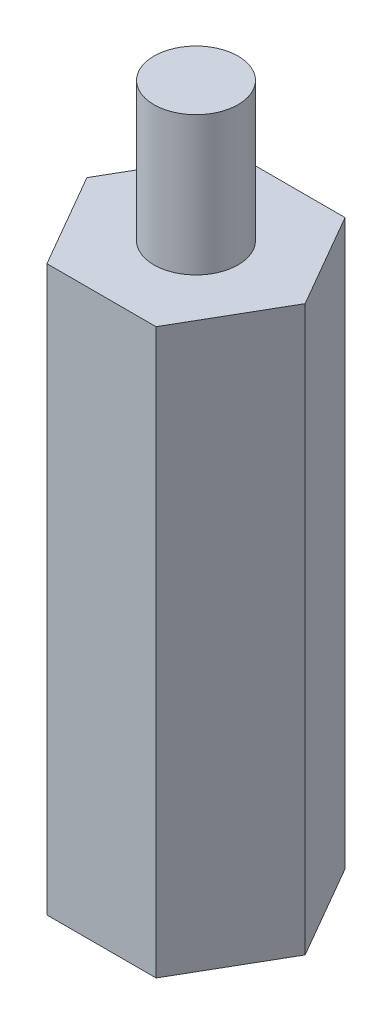
ISO-10303-21;
HEADER;
FILE_DESCRIPTION(('STEP AP214'),'2;1');
FILE_NAME('part.step','',(''),(''),'','','');
FILE_SCHEMA(('AUTOMOTIVE_DESIGN { 1 0 10303 214 1 1 1 1 }'));
ENDSEC;
DATA;
#1=APPLICATION_CONTEXT('core data for automotive mechanical design processes');
#2=APPLICATION_PROTOCOL_DEFINITION('international standard','automotive_design',2000,#1);
#3=PRODUCT_CONTEXT('',#1,'mechanical');
#4=PRODUCT('Part','Part','',(#3));
#5=PRODUCT_RELATED_PRODUCT_CATEGORY('part','',(#4));
#6=PRODUCT_DEFINITION_FORMATION('','',#4);
#7=PRODUCT_DEFINITION_CONTEXT('part definition',#1,'design');
#8=PRODUCT_DEFINITION('design','',#6,#7);
#9=PRODUCT_DEFINITION_SHAPE('','',#8);
#10=(LENGTH_UNIT() NAMED_UNIT(*) SI_UNIT(.MILLI.,.METRE.));
#11=(NAMED_UNIT(*) PLANE_ANGLE_UNIT() SI_UNIT($,.RADIAN.));
#12=(NAMED_UNIT(*) SI_UNIT($,.STERADIAN.) SOLID_ANGLE_UNIT());
#13=UNCERTAINTY_MEASURE_WITH_UNIT(LENGTH_MEASURE(1.E-05),#10,'distance_accuracy_value','');
#14=(GEOMETRIC_REPRESENTATION_CONTEXT(3) GLOBAL_UNCERTAINTY_ASSIGNED_CONTEXT((#13)) GLOBAL_UNIT_ASSIGNED_CONTEXT((#10,
#11,#12)) REPRESENTATION_CONTEXT('',''));
#15=CARTESIAN_POINT('',(0.,0.,0.));
#16=DIRECTION('',(0.,0.,1.));
#17=DIRECTION('',(1.,0.,0.));
#18=AXIS2_PLACEMENT_3D('',#15,#16,#17);
#19=CARTESIAN_POINT('',(3.6950417228136,19.1,0.));
#20=DIRECTION('',(-0.866025403784439,0.,0.5));
#21=DIRECTION('',(0.5,0.,0.866025403784439));
#22=AXIS2_PLACEMENT_3D('',#19,#20,#21);
#23=PLANE('',#22);
#24=DIRECTION('',(-0.5,0.,-0.866025403784439));
#25=VECTOR('',#24,1.);
#26=CARTESIAN_POINT('',(3.6950417228136,0.,0.));
#27=LINE('',#26,#25);
#28=CARTESIAN_POINT('',(3.6950417228136,0.,0.));
#29=VERTEX_POINT('',#28);
#30=CARTESIAN_POINT('',(1.8475208614068,0.,-3.20000000000001));
#31=VERTEX_POINT('',#30);
#32=EDGE_CURVE('E117',#29,#31,#27,.T.);
#33=ORIENTED_EDGE('',*,*,#32,.T.);
#34=DIRECTION('',(0.,-1.,0.));
#35=VECTOR('',#34,1.);
#36=CARTESIAN_POINT('',(1.8475208614068,19.1,-3.20000000000001));
#37=LINE('',#36,#35);
#38=CARTESIAN_POINT('',(1.8475208614068,19.1,-3.20000000000001));
#39=VERTEX_POINT('',#38);
#40=EDGE_CURVE('E11',#39,#31,#37,.T.);
#41=ORIENTED_EDGE('',*,*,#40,.F.);
#42=DIRECTION('',(-0.5,0.,-0.866025403784439));
#43=VECTOR('',#42,1.);
#44=CARTESIAN_POINT('',(3.6950417228136,19.1,0.));
#45=LINE('',#44,#43);
#46=CARTESIAN_POINT('',(3.6950417228136,19.1,0.));
#47=VERTEX_POINT('',#46);
#48=EDGE_CURVE('E128',#47,#39,#45,.T.);
#49=ORIENTED_EDGE('',*,*,#48,.F.);
#50=DIRECTION('',(0.,-1.,0.));
#51=VECTOR('',#50,1.);
#52=CARTESIAN_POINT('',(3.6950417228136,19.1,0.));
#53=LINE('',#52,#51);
#54=EDGE_CURVE('E113',#47,#29,#53,.T.);
#55=ORIENTED_EDGE('',*,*,#54,.T.);
#56=EDGE_LOOP('',(#33,#41,#49,#55));
#57=FACE_BOUND('',#56,.T.);
#58=ADVANCED_FACE('F33',(#57),#23,.F.);
#59=CARTESIAN_POINT('',(1.8475208614068,19.1,-3.20000000000001));
#60=DIRECTION('',(0.,0.,1.));
#61=DIRECTION('',(1.,0.,0.));
#62=AXIS2_PLACEMENT_3D('',#59,#60,#61);
#63=PLANE('',#62);
#64=DIRECTION('',(-1.,0.,0.));
#65=VECTOR('',#64,1.);
#66=CARTESIAN_POINT('',(1.8475208614068,0.,-3.20000000000001));
#67=LINE('',#66,#65);
#68=CARTESIAN_POINT('',(-1.8475208614068,0.,-3.20000000000001));
#69=VERTEX_POINT('',#68);
#70=EDGE_CURVE('E120',#31,#69,#67,.T.);
#71=ORIENTED_EDGE('',*,*,#70,.T.);
#72=DIRECTION('',(0.,-1.,0.));
#73=VECTOR('',#72,1.);
#74=CARTESIAN_POINT('',(-1.8475208614068,19.1,-3.20000000000001));
#75=LINE('',#74,#73);
#76=CARTESIAN_POINT('',(-1.8475208614068,19.1,-3.20000000000001));
#77=VERTEX_POINT('',#76);
#78=EDGE_CURVE('E41',#77,#69,#75,.T.);
#79=ORIENTED_EDGE('',*,*,#78,.F.);
#80=DIRECTION('',(-1.,0.,0.));
#81=VECTOR('',#80,1.);
#82=CARTESIAN_POINT('',(1.8475208614068,19.1,-3.20000000000001));
#83=LINE('',#82,#81);
#84=EDGE_CURVE('E86',#39,#77,#83,.T.);
#85=ORIENTED_EDGE('',*,*,#84,.F.);
#86=ORIENTED_EDGE('',*,*,#40,.T.);
#87=EDGE_LOOP('',(#71,#79,#85,#86));
#88=FACE_BOUND('',#87,.T.);
#89=ADVANCED_FACE('F153',(#88),#63,.F.);
#90=CARTESIAN_POINT('',(-1.8475208614068,19.1,-3.20000000000001));
#91=DIRECTION('',(0.866025403784439,0.,0.5));
#92=DIRECTION('',(0.5,0.,-0.866025403784439));
#93=AXIS2_PLACEMENT_3D('',#90,#91,#92);
#94=PLANE('',#93);
#95=DIRECTION('',(-0.5,0.,0.866025403784439));
#96=VECTOR('',#95,1.);
#97=CARTESIAN_POINT('',(-1.8475208614068,0.,-3.20000000000001));
#98=LINE('',#97,#96);
#99=CARTESIAN_POINT('',(-3.69504172281361,0.,0.));
#100=VERTEX_POINT('',#99);
#101=EDGE_CURVE('E123',#69,#100,#98,.T.);
#102=ORIENTED_EDGE('',*,*,#101,.T.);
#103=DIRECTION('',(0.,-1.,0.));
#104=VECTOR('',#103,1.);
#105=CARTESIAN_POINT('',(-3.69504172281361,19.1,0.));
#106=LINE('',#105,#104);
#107=CARTESIAN_POINT('',(-3.69504172281361,19.1,0.));
#108=VERTEX_POINT('',#107);
#109=EDGE_CURVE('E108',#108,#100,#106,.T.);
#110=ORIENTED_EDGE('',*,*,#109,.F.);
#111=DIRECTION('',(-0.5,0.,0.866025403784439));
#112=VECTOR('',#111,1.);
#113=CARTESIAN_POINT('',(-1.8475208614068,19.1,-3.20000000000001));
#114=LINE('',#113,#112);
#115=EDGE_CURVE('E99',#77,#108,#114,.T.);
#116=ORIENTED_EDGE('',*,*,#115,.F.);
#117=ORIENTED_EDGE('',*,*,#78,.T.);
#118=EDGE_LOOP('',(#102,#110,#116,#117));
#119=FACE_BOUND('',#118,.T.);
#120=ADVANCED_FACE('F134',(#119),#94,.F.);
#121=CARTESIAN_POINT('',(-3.69504172281361,19.1,0.));
#122=DIRECTION('',(0.866025403784439,0.,-0.5));
#123=DIRECTION('',(-0.5,0.,-0.866025403784439));
#124=AXIS2_PLACEMENT_3D('',#121,#122,#123);
#125=PLANE('',#124);
#126=DIRECTION('',(0.5,0.,0.866025403784439));
#127=VECTOR('',#126,1.);
#128=CARTESIAN_POINT('',(-3.69504172281361,0.,0.));
#129=LINE('',#128,#127);
#130=CARTESIAN_POINT('',(-1.84752086140681,0.,3.2));
#131=VERTEX_POINT('',#130);
#132=EDGE_CURVE('E107',#100,#131,#129,.T.);
#133=ORIENTED_EDGE('',*,*,#132,.T.);
#134=DIRECTION('',(0.,-1.,0.));
#135=VECTOR('',#134,1.);
#136=CARTESIAN_POINT('',(-1.84752086140681,19.1,3.2));
#137=LINE('',#136,#135);
#138=CARTESIAN_POINT('',(-1.84752086140681,19.1,3.2));
#139=VERTEX_POINT('',#138);
#140=EDGE_CURVE('E104',#139,#131,#137,.T.);
#141=ORIENTED_EDGE('',*,*,#140,.F.);
#142=DIRECTION('',(0.5,0.,0.866025403784439));
#143=VECTOR('',#142,1.);
#144=CARTESIAN_POINT('',(-3.69504172281361,19.1,0.));
#145=LINE('',#144,#143);
#146=EDGE_CURVE('E93',#108,#139,#145,.T.);
#147=ORIENTED_EDGE('',*,*,#146,.F.);
#148=ORIENTED_EDGE('',*,*,#109,.T.);
#149=EDGE_LOOP('',(#133,#141,#147,#148));
#150=FACE_BOUND('',#149,.T.);
#151=ADVANCED_FACE('F105',(#150),#125,.F.);
#152=CARTESIAN_POINT('',(-1.84752086140681,19.1,3.2));
#153=DIRECTION('',(0.,0.,-1.));
#154=DIRECTION('',(-1.,0.,0.));
#155=AXIS2_PLACEMENT_3D('',#152,#153,#154);
#156=PLANE('',#155);
#157=DIRECTION('',(1.,0.,0.));
#158=VECTOR('',#157,1.);
#159=CARTESIAN_POINT('',(-1.84752086140681,0.,3.2));
#160=LINE('',#159,#158);
#161=CARTESIAN_POINT('',(1.8475208614068,0.,3.2));
#162=VERTEX_POINT('',#161);
#163=EDGE_CURVE('E72',#131,#162,#160,.T.);
#164=ORIENTED_EDGE('',*,*,#163,.T.);
#165=DIRECTION('',(0.,-1.,0.));
#166=VECTOR('',#165,1.);
#167=CARTESIAN_POINT('',(1.8475208614068,19.1,3.2));
#168=LINE('',#167,#166);
#169=CARTESIAN_POINT('',(1.8475208614068,19.1,3.2));
#170=VERTEX_POINT('',#169);
#171=EDGE_CURVE('E109',#170,#162,#168,.T.);
#172=ORIENTED_EDGE('',*,*,#171,.F.);
#173=DIRECTION('',(1.,0.,0.));
#174=VECTOR('',#173,1.);
#175=CARTESIAN_POINT('',(-1.84752086140681,19.1,3.2));
#176=LINE('',#175,#174);
#177=EDGE_CURVE('E97',#139,#170,#176,.T.);
#178=ORIENTED_EDGE('',*,*,#177,.F.);
#179=ORIENTED_EDGE('',*,*,#140,.T.);
#180=EDGE_LOOP('',(#164,#172,#178,#179));
#181=FACE_BOUND('',#180,.T.);
#182=ADVANCED_FACE('F111',(#181),#156,.F.);
#183=CARTESIAN_POINT('',(1.8475208614068,19.1,3.2));
#184=DIRECTION('',(-0.866025403784439,0.,-0.5));
#185=DIRECTION('',(-0.5,0.,0.866025403784439));
#186=AXIS2_PLACEMENT_3D('',#183,#184,#185);
#187=PLANE('',#186);
#188=DIRECTION('',(0.5,0.,-0.866025403784439));
#189=VECTOR('',#188,1.);
#190=CARTESIAN_POINT('',(1.8475208614068,0.,3.2));
#191=LINE('',#190,#189);
#192=EDGE_CURVE('E78',#162,#29,#191,.T.);
#193=ORIENTED_EDGE('',*,*,#192,.T.);
#194=ORIENTED_EDGE('',*,*,#54,.F.);
#195=DIRECTION('',(0.5,0.,-0.866025403784439));
#196=VECTOR('',#195,1.);
#197=CARTESIAN_POINT('',(1.8475208614068,19.1,3.2));
#198=LINE('',#197,#196);
#199=EDGE_CURVE('E49',#170,#47,#198,.T.);
#200=ORIENTED_EDGE('',*,*,#199,.F.);
#201=ORIENTED_EDGE('',*,*,#171,.T.);
#202=EDGE_LOOP('',(#193,#194,#200,#201));
#203=FACE_BOUND('',#202,.T.);
#204=ADVANCED_FACE('F141',(#203),#187,.F.);
#205=CARTESIAN_POINT('',(0.,19.1,0.));
#206=DIRECTION('',(0.,1.,0.));
#207=DIRECTION('',(0.,0.,1.));
#208=AXIS2_PLACEMENT_3D('',#205,#206,#207);
#209=PLANE('',#208);
#210=CARTESIAN_POINT('',(0.,19.1,0.));
#211=DIRECTION('',(0.,1.,0.));
#212=DIRECTION('',(0.,0.,1.));
#213=AXIS2_PLACEMENT_3D('',#210,#211,#212);
#214=CIRCLE('',#213,1.425);
#215=CARTESIAN_POINT('',(0.,19.1,1.425));
#216=VERTEX_POINT('',#215);
#217=EDGE_CURVE('E236',#216,#216,#214,.T.);
#218=ORIENTED_EDGE('',*,*,#217,.F.);
#219=EDGE_LOOP('',(#218));
#220=FACE_BOUND('',#219,.T.);
#221=ORIENTED_EDGE('',*,*,#48,.T.);
#222=ORIENTED_EDGE('',*,*,#84,.T.);
#223=ORIENTED_EDGE('',*,*,#115,.T.);
#224=ORIENTED_EDGE('',*,*,#146,.T.);
#225=ORIENTED_EDGE('',*,*,#177,.T.);
#226=ORIENTED_EDGE('',*,*,#199,.T.);
#227=EDGE_LOOP('',(#221,#222,#223,#224,#225,#226));
#228=FACE_BOUND('',#227,.T.);
#229=ADVANCED_FACE('F95',(#220,#228),#209,.T.);
#230=CARTESIAN_POINT('',(0.,0.,0.));
#231=DIRECTION('',(0.,1.,0.));
#232=DIRECTION('',(0.,0.,1.));
#233=AXIS2_PLACEMENT_3D('',#230,#231,#232);
#234=PLANE('',#233);
#235=CARTESIAN_POINT('',(0.,0.,0.));
#236=DIRECTION('',(0.,-1.,0.));
#237=DIRECTION('',(0.,0.,-1.));
#238=AXIS2_PLACEMENT_3D('',#235,#236,#237);
#239=CIRCLE('',#238,1.425);
#240=CARTESIAN_POINT('',(0.,0.,-1.425));
#241=VERTEX_POINT('',#240);
#242=EDGE_CURVE('E237',#241,#241,#239,.T.);
#243=ORIENTED_EDGE('',*,*,#242,.F.);
#244=EDGE_LOOP('',(#243));
#245=FACE_BOUND('',#244,.T.);
#246=ORIENTED_EDGE('',*,*,#32,.F.);
#247=ORIENTED_EDGE('',*,*,#192,.F.);
#248=ORIENTED_EDGE('',*,*,#163,.F.);
#249=ORIENTED_EDGE('',*,*,#132,.F.);
#250=ORIENTED_EDGE('',*,*,#101,.F.);
#251=ORIENTED_EDGE('',*,*,#70,.F.);
#252=EDGE_LOOP('',(#246,#247,#248,#249,#250,#251));
#253=FACE_BOUND('',#252,.T.);
#254=ADVANCED_FACE('F137',(#245,#253),#234,.F.);
#255=CARTESIAN_POINT('',(0.,23.8,0.));
#256=DIRECTION('',(0.,-1.,0.));
#257=DIRECTION('',(0.,0.,-1.));
#258=AXIS2_PLACEMENT_3D('',#255,#256,#257);
#259=CYLINDRICAL_SURFACE('',#258,1.425);
#260=CARTESIAN_POINT('',(0.,23.8,0.));
#261=DIRECTION('',(0.,1.,0.));
#262=DIRECTION('',(0.,0.,1.));
#263=AXIS2_PLACEMENT_3D('',#260,#261,#262);
#264=CIRCLE('',#263,1.425);
#265=CARTESIAN_POINT('',(0.,23.8,1.425));
#266=VERTEX_POINT('',#265);
#267=EDGE_CURVE('E121',#266,#266,#264,.T.);
#268=ORIENTED_EDGE('',*,*,#267,.F.);
#269=EDGE_LOOP('',(#268));
#270=FACE_BOUND('',#269,.T.);
#271=ORIENTED_EDGE('',*,*,#217,.T.);
#272=EDGE_LOOP('',(#271));
#273=FACE_BOUND('',#272,.T.);
#274=ADVANCED_FACE('F188',(#270,#273),#259,.T.);
#275=CARTESIAN_POINT('',(0.,23.8,0.));
#276=DIRECTION('',(0.,1.,0.));
#277=DIRECTION('',(0.,0.,1.));
#278=AXIS2_PLACEMENT_3D('',#275,#276,#277);
#279=PLANE('',#278);
#280=ORIENTED_EDGE('',*,*,#267,.T.);
#281=EDGE_LOOP('',(#280));
#282=FACE_BOUND('',#281,.T.);
#283=ADVANCED_FACE('F193',(#282),#279,.T.);
#284=CARTESIAN_POINT('',(0.,4.,0.));
#285=DIRECTION('',(0.,-1.,0.));
#286=DIRECTION('',(0.,0.,-1.));
#287=AXIS2_PLACEMENT_3D('',#284,#285,#286);
#288=CYLINDRICAL_SURFACE('',#287,1.425);
#289=CARTESIAN_POINT('',(0.,4.,0.));
#290=DIRECTION('',(0.,-1.,0.));
#291=DIRECTION('',(0.,0.,-1.));
#292=AXIS2_PLACEMENT_3D('',#289,#290,#291);
#293=CIRCLE('',#292,1.425);
#294=CARTESIAN_POINT('',(0.,4.,-1.425));
#295=VERTEX_POINT('',#294);
#296=EDGE_CURVE('E235',#295,#295,#293,.T.);
#297=ORIENTED_EDGE('',*,*,#296,.F.);
#298=EDGE_LOOP('',(#297));
#299=FACE_BOUND('',#298,.T.);
#300=ORIENTED_EDGE('',*,*,#242,.T.);
#301=EDGE_LOOP('',(#300));
#302=FACE_BOUND('',#301,.T.);
#303=ADVANCED_FACE('F203',(#299,#302),#288,.F.);
#304=CARTESIAN_POINT('',(0.,4.,0.));
#305=DIRECTION('',(0.,-1.,0.));
#306=DIRECTION('',(0.,0.,-1.));
#307=AXIS2_PLACEMENT_3D('',#304,#305,#306);
#308=PLANE('',#307);
#309=ORIENTED_EDGE('',*,*,#296,.T.);
#310=EDGE_LOOP('',(#309));
#311=FACE_BOUND('',#310,.T.);
#312=ADVANCED_FACE('F219',(#311),#308,.T.);
#313=CLOSED_SHELL('',(#58,#89,#120,#151,#182,#204,#229,#254,#274,#283,#303,#312));
#314=MANIFOLD_SOLID_BREP('B2',#313);
#315=ADVANCED_BREP_SHAPE_REPRESENTATION('',(#18,#314),#14);
#316=SHAPE_DEFINITION_REPRESENTATION(#9,#315);
ENDSEC;
END-ISO-10303-21;
